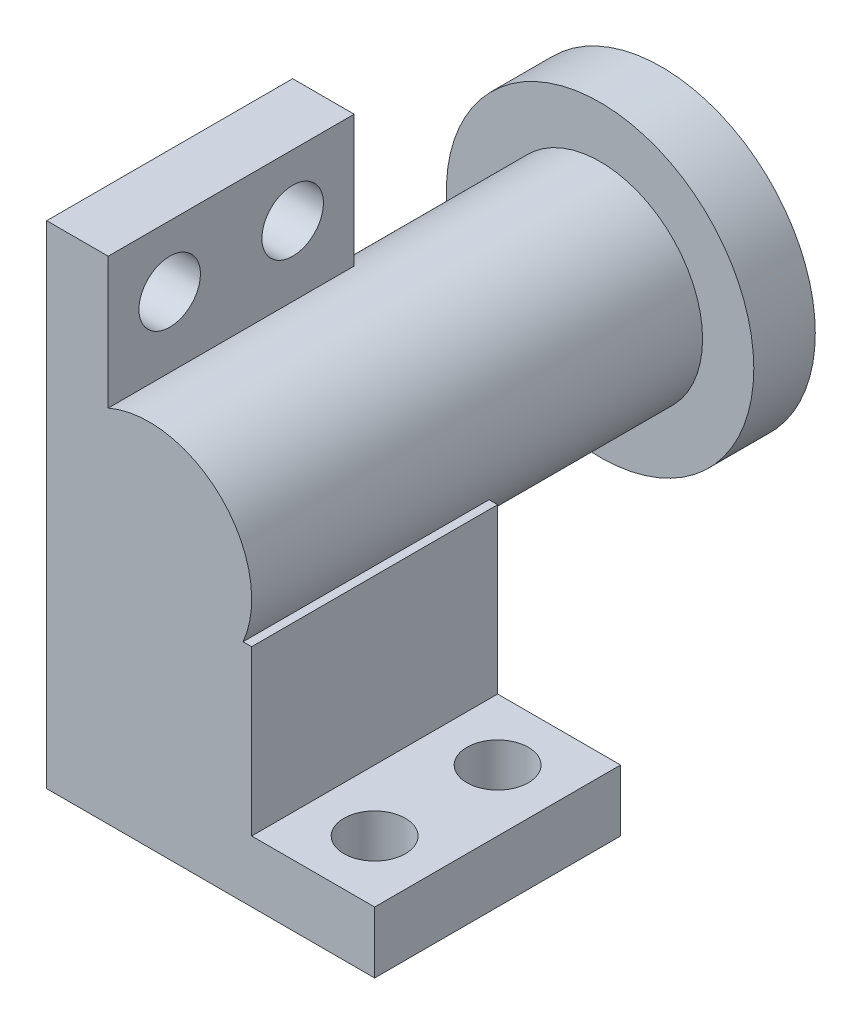
ISO-10303-21;
HEADER;
FILE_DESCRIPTION(('STEP AP214'),'2;1');
FILE_NAME('part.step','',(''),(''),'','','');
FILE_SCHEMA(('AUTOMOTIVE_DESIGN { 1 0 10303 214 1 1 1 1 }'));
ENDSEC;
DATA;
#1=APPLICATION_CONTEXT('core data for automotive mechanical design processes');
#2=APPLICATION_PROTOCOL_DEFINITION('international standard','automotive_design',2000,#1);
#3=PRODUCT_CONTEXT('',#1,'mechanical');
#4=PRODUCT('Part','Part','',(#3));
#5=PRODUCT_RELATED_PRODUCT_CATEGORY('part','',(#4));
#6=PRODUCT_DEFINITION_FORMATION('','',#4);
#7=PRODUCT_DEFINITION_CONTEXT('part definition',#1,'design');
#8=PRODUCT_DEFINITION('design','',#6,#7);
#9=PRODUCT_DEFINITION_SHAPE('','',#8);
#10=(LENGTH_UNIT() NAMED_UNIT(*) SI_UNIT(.MILLI.,.METRE.));
#11=(NAMED_UNIT(*) PLANE_ANGLE_UNIT() SI_UNIT($,.RADIAN.));
#12=(NAMED_UNIT(*) SI_UNIT($,.STERADIAN.) SOLID_ANGLE_UNIT());
#13=UNCERTAINTY_MEASURE_WITH_UNIT(LENGTH_MEASURE(1.E-05),#10,'distance_accuracy_value','');
#14=(GEOMETRIC_REPRESENTATION_CONTEXT(3) GLOBAL_UNCERTAINTY_ASSIGNED_CONTEXT((#13)) GLOBAL_UNIT_ASSIGNED_CONTEXT((#10,
#11,#12)) REPRESENTATION_CONTEXT('',''));
#15=CARTESIAN_POINT('',(0.,0.,0.));
#16=DIRECTION('',(0.,0.,1.));
#17=DIRECTION('',(1.,0.,0.));
#18=AXIS2_PLACEMENT_3D('',#15,#16,#17);
#19=CARTESIAN_POINT('',(11.,0.,38.));
#20=DIRECTION('',(-1.,0.,0.));
#21=DIRECTION('',(0.,0.,-1.));
#22=AXIS2_PLACEMENT_3D('',#19,#20,#21);
#23=PLANE('',#22);
#24=DIRECTION('',(0.,0.,1.));
#25=VECTOR('',#24,1.);
#26=CARTESIAN_POINT('',(11.,-10.,50.));
#27=LINE('',#26,#25);
#28=CARTESIAN_POINT('',(11.,-10.,38.));
#29=VERTEX_POINT('',#28);
#30=CARTESIAN_POINT('',(11.,-10.,50.));
#31=VERTEX_POINT('',#30);
#32=EDGE_CURVE('E125',#29,#31,#27,.T.);
#33=ORIENTED_EDGE('',*,*,#32,.T.);
#34=DIRECTION('',(0.,1.,0.));
#35=VECTOR('',#34,1.);
#36=CARTESIAN_POINT('',(11.,0.,50.));
#37=LINE('',#36,#35);
#38=CARTESIAN_POINT('',(11.,-13.,50.));
#39=VERTEX_POINT('',#38);
#40=EDGE_CURVE('E187',#39,#31,#37,.T.);
#41=ORIENTED_EDGE('',*,*,#40,.F.);
#42=DIRECTION('',(0.,0.,1.));
#43=VECTOR('',#42,1.);
#44=CARTESIAN_POINT('',(11.,-13.,38.));
#45=LINE('',#44,#43);
#46=CARTESIAN_POINT('',(11.,-13.,38.));
#47=VERTEX_POINT('',#46);
#48=EDGE_CURVE('E44',#47,#39,#45,.T.);
#49=ORIENTED_EDGE('',*,*,#48,.F.);
#50=DIRECTION('',(0.,1.,0.));
#51=VECTOR('',#50,1.);
#52=CARTESIAN_POINT('',(11.,0.,38.));
#53=LINE('',#52,#51);
#54=EDGE_CURVE('E172',#47,#29,#53,.T.);
#55=ORIENTED_EDGE('',*,*,#54,.T.);
#56=EDGE_LOOP('',(#33,#41,#49,#55));
#57=FACE_BOUND('',#56,.T.);
#58=ADVANCED_FACE('F35',(#57),#23,.F.);
#59=CARTESIAN_POINT('',(8.,-13.,41.));
#60=DIRECTION('',(0.,1.,0.));
#61=DIRECTION('',(0.,0.,-1.));
#62=AXIS2_PLACEMENT_3D('',#59,#60,#61);
#63=CYLINDRICAL_SURFACE('',#62,1.5);
#64=CARTESIAN_POINT('',(8.,-13.,41.));
#65=DIRECTION('',(0.,-1.,0.));
#66=DIRECTION('',(0.,0.,-1.));
#67=AXIS2_PLACEMENT_3D('',#64,#65,#66);
#68=CIRCLE('',#67,1.5);
#69=CARTESIAN_POINT('',(8.,-13.,39.5));
#70=VERTEX_POINT('',#69);
#71=EDGE_CURVE('E141',#70,#70,#68,.T.);
#72=ORIENTED_EDGE('',*,*,#71,.T.);
#73=EDGE_LOOP('',(#72));
#74=FACE_BOUND('',#73,.T.);
#75=CARTESIAN_POINT('',(8.,-10.,41.));
#76=DIRECTION('',(0.,-1.,0.));
#77=DIRECTION('',(-1.,0.,0.));
#78=AXIS2_PLACEMENT_3D('',#75,#76,#77);
#79=CIRCLE('',#78,1.5);
#80=CARTESIAN_POINT('',(6.5,-10.,41.));
#81=VERTEX_POINT('',#80);
#82=EDGE_CURVE('E138',#81,#81,#79,.F.);
#83=ORIENTED_EDGE('',*,*,#82,.T.);
#84=EDGE_LOOP('',(#83));
#85=FACE_BOUND('',#84,.T.);
#86=ADVANCED_FACE('F255',(#74,#85),#63,.F.);
#87=CARTESIAN_POINT('',(8.,-13.,47.));
#88=DIRECTION('',(0.,1.,0.));
#89=DIRECTION('',(0.,0.,-1.));
#90=AXIS2_PLACEMENT_3D('',#87,#88,#89);
#91=CYLINDRICAL_SURFACE('',#90,1.5);
#92=CARTESIAN_POINT('',(8.,-13.,47.));
#93=DIRECTION('',(0.,-1.,0.));
#94=DIRECTION('',(0.,0.,-1.));
#95=AXIS2_PLACEMENT_3D('',#92,#93,#94);
#96=CIRCLE('',#95,1.5);
#97=CARTESIAN_POINT('',(8.,-13.,45.5));
#98=VERTEX_POINT('',#97);
#99=EDGE_CURVE('E142',#98,#98,#96,.T.);
#100=ORIENTED_EDGE('',*,*,#99,.T.);
#101=EDGE_LOOP('',(#100));
#102=FACE_BOUND('',#101,.T.);
#103=CARTESIAN_POINT('',(8.,-10.,47.));
#104=DIRECTION('',(0.,-1.,0.));
#105=DIRECTION('',(-1.,0.,0.));
#106=AXIS2_PLACEMENT_3D('',#103,#104,#105);
#107=CIRCLE('',#106,1.5);
#108=CARTESIAN_POINT('',(6.5,-10.,47.));
#109=VERTEX_POINT('',#108);
#110=EDGE_CURVE('E39',#109,#109,#107,.F.);
#111=ORIENTED_EDGE('',*,*,#110,.T.);
#112=EDGE_LOOP('',(#111));
#113=FACE_BOUND('',#112,.T.);
#114=ADVANCED_FACE('F259',(#102,#113),#91,.F.);
#115=CARTESIAN_POINT('',(0.,0.,38.));
#116=DIRECTION('',(0.,0.,-1.));
#117=DIRECTION('',(1.,0.,0.));
#118=AXIS2_PLACEMENT_3D('',#115,#116,#117);
#119=PLANE('',#118);
#120=CARTESIAN_POINT('',(0.,0.,38.));
#121=DIRECTION('',(0.,0.,1.));
#122=DIRECTION('',(1.,0.,0.));
#123=AXIS2_PLACEMENT_3D('',#120,#121,#122);
#124=CIRCLE('',#123,5.);
#125=CARTESIAN_POINT('',(-2.,4.58257569495584,38.));
#126=VERTEX_POINT('',#125);
#127=CARTESIAN_POINT('',(-5.,0.,38.));
#128=VERTEX_POINT('',#127);
#129=EDGE_CURVE('E46',#126,#128,#124,.T.);
#130=ORIENTED_EDGE('',*,*,#129,.T.);
#131=DIRECTION('',(0.,1.,0.));
#132=VECTOR('',#131,1.);
#133=CARTESIAN_POINT('',(-5.,0.,38.));
#134=LINE('',#133,#132);
#135=CARTESIAN_POINT('',(-5.,11.,38.));
#136=VERTEX_POINT('',#135);
#137=EDGE_CURVE('E182',#128,#136,#134,.T.);
#138=ORIENTED_EDGE('',*,*,#137,.T.);
#139=DIRECTION('',(1.,0.,0.));
#140=VECTOR('',#139,1.);
#141=CARTESIAN_POINT('',(0.,11.,38.));
#142=LINE('',#141,#140);
#143=CARTESIAN_POINT('',(-2.,11.,38.));
#144=VERTEX_POINT('',#143);
#145=EDGE_CURVE('E179',#136,#144,#142,.T.);
#146=ORIENTED_EDGE('',*,*,#145,.T.);
#147=DIRECTION('',(0.,-1.,0.));
#148=VECTOR('',#147,1.);
#149=CARTESIAN_POINT('',(-2.,0.,38.));
#150=LINE('',#149,#148);
#151=EDGE_CURVE('E176',#144,#126,#150,.T.);
#152=ORIENTED_EDGE('',*,*,#151,.T.);
#153=EDGE_LOOP('',(#130,#138,#146,#152));
#154=FACE_BOUND('',#153,.T.);
#155=ADVANCED_FACE('F230',(#154),#119,.T.);
#156=CARTESIAN_POINT('',(0.,-13.,38.));
#157=DIRECTION('',(0.,-1.,0.));
#158=DIRECTION('',(1.,0.,0.));
#159=AXIS2_PLACEMENT_3D('',#156,#157,#158);
#160=PLANE('',#159);
#161=ORIENTED_EDGE('',*,*,#99,.F.);
#162=EDGE_LOOP('',(#161));
#163=FACE_BOUND('',#162,.T.);
#164=ORIENTED_EDGE('',*,*,#71,.F.);
#165=EDGE_LOOP('',(#164));
#166=FACE_BOUND('',#165,.T.);
#167=DIRECTION('',(-1.,0.,0.));
#168=VECTOR('',#167,1.);
#169=CARTESIAN_POINT('',(0.,-13.,50.));
#170=LINE('',#169,#168);
#171=CARTESIAN_POINT('',(-5.,-13.,50.));
#172=VERTEX_POINT('',#171);
#173=EDGE_CURVE('E167',#39,#172,#170,.T.);
#174=ORIENTED_EDGE('',*,*,#173,.T.);
#175=DIRECTION('',(0.,0.,1.));
#176=VECTOR('',#175,1.);
#177=CARTESIAN_POINT('',(-5.,-13.,38.));
#178=LINE('',#177,#176);
#179=CARTESIAN_POINT('',(-5.,-13.,38.));
#180=VERTEX_POINT('',#179);
#181=EDGE_CURVE('E184',#180,#172,#178,.T.);
#182=ORIENTED_EDGE('',*,*,#181,.F.);
#183=DIRECTION('',(-1.,0.,0.));
#184=VECTOR('',#183,1.);
#185=CARTESIAN_POINT('',(0.,-13.,38.));
#186=LINE('',#185,#184);
#187=EDGE_CURVE('E170',#47,#180,#186,.T.);
#188=ORIENTED_EDGE('',*,*,#187,.F.);
#189=ORIENTED_EDGE('',*,*,#48,.T.);
#190=EDGE_LOOP('',(#174,#182,#188,#189));
#191=FACE_BOUND('',#190,.T.);
#192=ADVANCED_FACE('F37',(#163,#166,#191),#160,.T.);
#193=CARTESIAN_POINT('',(0.,-2.,38.));
#194=DIRECTION('',(0.,-1.,0.));
#195=DIRECTION('',(1.,0.,0.));
#196=AXIS2_PLACEMENT_3D('',#193,#194,#195);
#197=PLANE('',#196);
#198=DIRECTION('',(-1.,0.,0.));
#199=VECTOR('',#198,1.);
#200=CARTESIAN_POINT('',(0.,-2.,38.));
#201=LINE('',#200,#199);
#202=CARTESIAN_POINT('',(5.,-2.,38.));
#203=VERTEX_POINT('',#202);
#204=CARTESIAN_POINT('',(4.58257569495584,-2.,38.));
#205=VERTEX_POINT('',#204);
#206=EDGE_CURVE('E132',#203,#205,#201,.T.);
#207=ORIENTED_EDGE('',*,*,#206,.T.);
#208=DIRECTION('',(0.,0.,1.));
#209=VECTOR('',#208,1.);
#210=CARTESIAN_POINT('',(4.58257569495584,-2.,38.));
#211=LINE('',#210,#209);
#212=CARTESIAN_POINT('',(4.58257569495584,-2.,50.));
#213=VERTEX_POINT('',#212);
#214=EDGE_CURVE('E211',#205,#213,#211,.T.);
#215=ORIENTED_EDGE('',*,*,#214,.T.);
#216=DIRECTION('',(-1.,0.,0.));
#217=VECTOR('',#216,1.);
#218=CARTESIAN_POINT('',(0.,-2.,50.));
#219=LINE('',#218,#217);
#220=CARTESIAN_POINT('',(5.,-2.,50.));
#221=VERTEX_POINT('',#220);
#222=EDGE_CURVE('E189',#221,#213,#219,.T.);
#223=ORIENTED_EDGE('',*,*,#222,.F.);
#224=DIRECTION('',(0.,0.,-1.));
#225=VECTOR('',#224,1.);
#226=CARTESIAN_POINT('',(5.,-2.,50.));
#227=LINE('',#226,#225);
#228=EDGE_CURVE('E120',#221,#203,#227,.T.);
#229=ORIENTED_EDGE('',*,*,#228,.T.);
#230=EDGE_LOOP('',(#207,#215,#223,#229));
#231=FACE_BOUND('',#230,.T.);
#232=ADVANCED_FACE('F238',(#231),#197,.F.);
#233=CARTESIAN_POINT('',(0.,0.,38.));
#234=DIRECTION('',(0.,0.,1.));
#235=DIRECTION('',(-1.,0.,0.));
#236=AXIS2_PLACEMENT_3D('',#233,#234,#235);
#237=CYLINDRICAL_SURFACE('',#236,5.);
#238=CARTESIAN_POINT('',(0.,0.,50.));
#239=DIRECTION('',(0.,0.,1.));
#240=DIRECTION('',(1.,0.,0.));
#241=AXIS2_PLACEMENT_3D('',#238,#239,#240);
#242=CIRCLE('',#241,5.);
#243=CARTESIAN_POINT('',(-2.,4.58257569495584,50.));
#244=VERTEX_POINT('',#243);
#245=EDGE_CURVE('E192',#213,#244,#242,.T.);
#246=ORIENTED_EDGE('',*,*,#245,.F.);
#247=ORIENTED_EDGE('',*,*,#214,.F.);
#248=EDGE_CURVE('E11',#128,#205,#124,.T.);
#249=ORIENTED_EDGE('',*,*,#248,.F.);
#250=ORIENTED_EDGE('',*,*,#129,.F.);
#251=DIRECTION('',(0.,0.,1.));
#252=VECTOR('',#251,1.);
#253=CARTESIAN_POINT('',(-2.,4.58257569495584,38.));
#254=LINE('',#253,#252);
#255=EDGE_CURVE('E208',#126,#244,#254,.T.);
#256=ORIENTED_EDGE('',*,*,#255,.T.);
#257=EDGE_LOOP('',(#246,#247,#249,#250,#256));
#258=FACE_BOUND('',#257,.T.);
#259=CARTESIAN_POINT('',(0.,0.,28.));
#260=DIRECTION('',(0.,0.,1.));
#261=DIRECTION('',(1.,0.,0.));
#262=AXIS2_PLACEMENT_3D('',#259,#260,#261);
#263=CIRCLE('',#262,5.);
#264=CARTESIAN_POINT('',(5.,0.,28.));
#265=VERTEX_POINT('',#264);
#266=EDGE_CURVE('E165',#265,#265,#263,.T.);
#267=ORIENTED_EDGE('',*,*,#266,.T.);
#268=EDGE_LOOP('',(#267));
#269=FACE_BOUND('',#268,.T.);
#270=ADVANCED_FACE('F233',(#258,#269),#237,.T.);
#271=CARTESIAN_POINT('',(-2.,0.,38.));
#272=DIRECTION('',(1.,0.,0.));
#273=DIRECTION('',(0.,1.,0.));
#274=AXIS2_PLACEMENT_3D('',#271,#272,#273);
#275=PLANE('',#274);
#276=CARTESIAN_POINT('',(-2.,7.99853829447893,41.));
#277=DIRECTION('',(-1.,0.,0.));
#278=DIRECTION('',(0.,1.,0.));
#279=AXIS2_PLACEMENT_3D('',#276,#277,#278);
#280=CIRCLE('',#279,1.5);
#281=CARTESIAN_POINT('',(-2.,9.49853829447893,41.));
#282=VERTEX_POINT('',#281);
#283=EDGE_CURVE('E152',#282,#282,#280,.T.);
#284=ORIENTED_EDGE('',*,*,#283,.T.);
#285=EDGE_LOOP('',(#284));
#286=FACE_BOUND('',#285,.T.);
#287=CARTESIAN_POINT('',(-2.,7.99853829447893,47.));
#288=DIRECTION('',(-1.,0.,0.));
#289=DIRECTION('',(0.,1.,0.));
#290=AXIS2_PLACEMENT_3D('',#287,#288,#289);
#291=CIRCLE('',#290,1.5);
#292=CARTESIAN_POINT('',(-2.,9.49853829447893,47.));
#293=VERTEX_POINT('',#292);
#294=EDGE_CURVE('E145',#293,#293,#291,.T.);
#295=ORIENTED_EDGE('',*,*,#294,.T.);
#296=EDGE_LOOP('',(#295));
#297=FACE_BOUND('',#296,.T.);
#298=DIRECTION('',(0.,-1.,0.));
#299=VECTOR('',#298,1.);
#300=CARTESIAN_POINT('',(-2.,0.,50.));
#301=LINE('',#300,#299);
#302=CARTESIAN_POINT('',(-2.,11.,50.));
#303=VERTEX_POINT('',#302);
#304=EDGE_CURVE('E195',#303,#244,#301,.T.);
#305=ORIENTED_EDGE('',*,*,#304,.T.);
#306=ORIENTED_EDGE('',*,*,#255,.F.);
#307=ORIENTED_EDGE('',*,*,#151,.F.);
#308=DIRECTION('',(0.,0.,1.));
#309=VECTOR('',#308,1.);
#310=CARTESIAN_POINT('',(-2.,11.,38.));
#311=LINE('',#310,#309);
#312=EDGE_CURVE('E205',#144,#303,#311,.T.);
#313=ORIENTED_EDGE('',*,*,#312,.T.);
#314=EDGE_LOOP('',(#305,#306,#307,#313));
#315=FACE_BOUND('',#314,.T.);
#316=ADVANCED_FACE('F241',(#286,#297,#315),#275,.T.);
#317=CARTESIAN_POINT('',(0.,11.,38.));
#318=DIRECTION('',(0.,1.,0.));
#319=DIRECTION('',(0.,0.,-1.));
#320=AXIS2_PLACEMENT_3D('',#317,#318,#319);
#321=PLANE('',#320);
#322=DIRECTION('',(1.,0.,0.));
#323=VECTOR('',#322,1.);
#324=CARTESIAN_POINT('',(0.,11.,50.));
#325=LINE('',#324,#323);
#326=CARTESIAN_POINT('',(-5.,11.,50.));
#327=VERTEX_POINT('',#326);
#328=EDGE_CURVE('E197',#327,#303,#325,.T.);
#329=ORIENTED_EDGE('',*,*,#328,.T.);
#330=ORIENTED_EDGE('',*,*,#312,.F.);
#331=ORIENTED_EDGE('',*,*,#145,.F.);
#332=DIRECTION('',(0.,0.,1.));
#333=VECTOR('',#332,1.);
#334=CARTESIAN_POINT('',(-5.,11.,38.));
#335=LINE('',#334,#333);
#336=EDGE_CURVE('E202',#136,#327,#335,.T.);
#337=ORIENTED_EDGE('',*,*,#336,.T.);
#338=EDGE_LOOP('',(#329,#330,#331,#337));
#339=FACE_BOUND('',#338,.T.);
#340=ADVANCED_FACE('F243',(#339),#321,.T.);
#341=CARTESIAN_POINT('',(-5.,0.,38.));
#342=DIRECTION('',(-1.,0.,0.));
#343=DIRECTION('',(0.,0.,-1.));
#344=AXIS2_PLACEMENT_3D('',#341,#342,#343);
#345=PLANE('',#344);
#346=CARTESIAN_POINT('',(-5.,7.99853829447893,41.));
#347=DIRECTION('',(-1.,0.,0.));
#348=DIRECTION('',(0.,1.,0.));
#349=AXIS2_PLACEMENT_3D('',#346,#347,#348);
#350=CIRCLE('',#349,1.5);
#351=CARTESIAN_POINT('',(-5.,9.49853829447893,41.));
#352=VERTEX_POINT('',#351);
#353=EDGE_CURVE('E148',#352,#352,#350,.T.);
#354=ORIENTED_EDGE('',*,*,#353,.F.);
#355=EDGE_LOOP('',(#354));
#356=FACE_BOUND('',#355,.T.);
#357=CARTESIAN_POINT('',(-5.,7.99853829447893,47.));
#358=DIRECTION('',(-1.,0.,0.));
#359=DIRECTION('',(0.,1.,0.));
#360=AXIS2_PLACEMENT_3D('',#357,#358,#359);
#361=CIRCLE('',#360,1.5);
#362=CARTESIAN_POINT('',(-5.,9.49853829447893,47.));
#363=VERTEX_POINT('',#362);
#364=EDGE_CURVE('E155',#363,#363,#361,.T.);
#365=ORIENTED_EDGE('',*,*,#364,.F.);
#366=EDGE_LOOP('',(#365));
#367=FACE_BOUND('',#366,.T.);
#368=DIRECTION('',(0.,1.,0.));
#369=VECTOR('',#368,1.);
#370=CARTESIAN_POINT('',(-5.,0.,50.));
#371=LINE('',#370,#369);
#372=EDGE_CURVE('E173',#172,#327,#371,.T.);
#373=ORIENTED_EDGE('',*,*,#372,.T.);
#374=ORIENTED_EDGE('',*,*,#336,.F.);
#375=ORIENTED_EDGE('',*,*,#137,.F.);
#376=EDGE_CURVE('E60',#180,#128,#134,.T.);
#377=ORIENTED_EDGE('',*,*,#376,.F.);
#378=ORIENTED_EDGE('',*,*,#181,.T.);
#379=EDGE_LOOP('',(#373,#374,#375,#377,#378));
#380=FACE_BOUND('',#379,.T.);
#381=ADVANCED_FACE('F224',(#356,#367,#380),#345,.T.);
#382=DIRECTION('',(0.,1.,0.));
#383=VECTOR('',#382,1.);
#384=CARTESIAN_POINT('',(5.,-10.,38.));
#385=LINE('',#384,#383);
#386=CARTESIAN_POINT('',(5.,-10.,38.));
#387=VERTEX_POINT('',#386);
#388=EDGE_CURVE('E116',#387,#203,#385,.T.);
#389=ORIENTED_EDGE('',*,*,#388,.F.);
#390=DIRECTION('',(1.,0.,0.));
#391=VECTOR('',#390,1.);
#392=CARTESIAN_POINT('',(5.,-10.,38.));
#393=LINE('',#392,#391);
#394=EDGE_CURVE('E119',#387,#29,#393,.T.);
#395=ORIENTED_EDGE('',*,*,#394,.T.);
#396=ORIENTED_EDGE('',*,*,#54,.F.);
#397=ORIENTED_EDGE('',*,*,#187,.T.);
#398=ORIENTED_EDGE('',*,*,#376,.T.);
#399=ORIENTED_EDGE('',*,*,#248,.T.);
#400=ORIENTED_EDGE('',*,*,#206,.F.);
#401=EDGE_LOOP('',(#389,#395,#396,#397,#398,#399,#400));
#402=FACE_BOUND('',#401,.T.);
#403=ADVANCED_FACE('F130',(#402),#119,.T.);
#404=CARTESIAN_POINT('',(0.,0.,50.));
#405=DIRECTION('',(0.,0.,-1.));
#406=DIRECTION('',(1.,0.,0.));
#407=AXIS2_PLACEMENT_3D('',#404,#405,#406);
#408=PLANE('',#407);
#409=ORIENTED_EDGE('',*,*,#222,.T.);
#410=ORIENTED_EDGE('',*,*,#245,.T.);
#411=ORIENTED_EDGE('',*,*,#304,.F.);
#412=ORIENTED_EDGE('',*,*,#328,.F.);
#413=ORIENTED_EDGE('',*,*,#372,.F.);
#414=ORIENTED_EDGE('',*,*,#173,.F.);
#415=ORIENTED_EDGE('',*,*,#40,.T.);
#416=DIRECTION('',(-1.,0.,0.));
#417=VECTOR('',#416,1.);
#418=CARTESIAN_POINT('',(5.,-10.,50.));
#419=LINE('',#418,#417);
#420=CARTESIAN_POINT('',(5.,-10.,50.));
#421=VERTEX_POINT('',#420);
#422=EDGE_CURVE('E53',#31,#421,#419,.T.);
#423=ORIENTED_EDGE('',*,*,#422,.T.);
#424=DIRECTION('',(0.,1.,0.));
#425=VECTOR('',#424,1.);
#426=CARTESIAN_POINT('',(5.,-10.,50.));
#427=LINE('',#426,#425);
#428=EDGE_CURVE('E118',#421,#221,#427,.T.);
#429=ORIENTED_EDGE('',*,*,#428,.T.);
#430=EDGE_LOOP('',(#409,#410,#411,#412,#413,#414,#415,#423,#429));
#431=FACE_BOUND('',#430,.T.);
#432=ADVANCED_FACE('F220',(#431),#408,.F.);
#433=CARTESIAN_POINT('',(0.,0.,25.));
#434=DIRECTION('',(0.,0.,1.));
#435=DIRECTION('',(-1.,0.,0.));
#436=AXIS2_PLACEMENT_3D('',#433,#434,#435);
#437=CYLINDRICAL_SURFACE('',#436,7.5);
#438=CARTESIAN_POINT('',(0.,0.,25.));
#439=DIRECTION('',(0.,0.,1.));
#440=DIRECTION('',(1.,0.,0.));
#441=AXIS2_PLACEMENT_3D('',#438,#439,#440);
#442=CIRCLE('',#441,7.5);
#443=CARTESIAN_POINT('',(7.5,0.,25.));
#444=VERTEX_POINT('',#443);
#445=EDGE_CURVE('E160',#444,#444,#442,.T.);
#446=ORIENTED_EDGE('',*,*,#445,.T.);
#447=EDGE_LOOP('',(#446));
#448=FACE_BOUND('',#447,.T.);
#449=CARTESIAN_POINT('',(0.,0.,28.));
#450=DIRECTION('',(0.,0.,1.));
#451=DIRECTION('',(1.,0.,0.));
#452=AXIS2_PLACEMENT_3D('',#449,#450,#451);
#453=CIRCLE('',#452,7.5);
#454=CARTESIAN_POINT('',(7.5,0.,28.));
#455=VERTEX_POINT('',#454);
#456=EDGE_CURVE('E151',#455,#455,#453,.T.);
#457=ORIENTED_EDGE('',*,*,#456,.F.);
#458=EDGE_LOOP('',(#457));
#459=FACE_BOUND('',#458,.T.);
#460=ADVANCED_FACE('F307',(#448,#459),#437,.T.);
#461=CARTESIAN_POINT('',(0.,0.,25.));
#462=DIRECTION('',(0.,0.,-1.));
#463=DIRECTION('',(1.,0.,0.));
#464=AXIS2_PLACEMENT_3D('',#461,#462,#463);
#465=PLANE('',#464);
#466=ORIENTED_EDGE('',*,*,#445,.F.);
#467=EDGE_LOOP('',(#466));
#468=FACE_BOUND('',#467,.T.);
#469=ADVANCED_FACE('F317',(#468),#465,.T.);
#470=CARTESIAN_POINT('',(0.,0.,28.));
#471=DIRECTION('',(0.,0.,-1.));
#472=DIRECTION('',(1.,0.,0.));
#473=AXIS2_PLACEMENT_3D('',#470,#471,#472);
#474=PLANE('',#473);
#475=ORIENTED_EDGE('',*,*,#266,.F.);
#476=EDGE_LOOP('',(#475));
#477=FACE_BOUND('',#476,.T.);
#478=ORIENTED_EDGE('',*,*,#456,.T.);
#479=EDGE_LOOP('',(#478));
#480=FACE_BOUND('',#479,.T.);
#481=ADVANCED_FACE('F327',(#477,#480),#474,.F.);
#482=CARTESIAN_POINT('',(-5.,7.99853829447893,47.));
#483=DIRECTION('',(1.,0.,0.));
#484=DIRECTION('',(0.,1.,0.));
#485=AXIS2_PLACEMENT_3D('',#482,#483,#484);
#486=CYLINDRICAL_SURFACE('',#485,1.5);
#487=ORIENTED_EDGE('',*,*,#364,.T.);
#488=EDGE_LOOP('',(#487));
#489=FACE_BOUND('',#488,.T.);
#490=ORIENTED_EDGE('',*,*,#294,.F.);
#491=EDGE_LOOP('',(#490));
#492=FACE_BOUND('',#491,.T.);
#493=ADVANCED_FACE('F337',(#489,#492),#486,.F.);
#494=CARTESIAN_POINT('',(-5.,7.99853829447893,41.));
#495=DIRECTION('',(1.,0.,0.));
#496=DIRECTION('',(0.,1.,0.));
#497=AXIS2_PLACEMENT_3D('',#494,#495,#496);
#498=CYLINDRICAL_SURFACE('',#497,1.5);
#499=ORIENTED_EDGE('',*,*,#353,.T.);
#500=EDGE_LOOP('',(#499));
#501=FACE_BOUND('',#500,.T.);
#502=ORIENTED_EDGE('',*,*,#283,.F.);
#503=EDGE_LOOP('',(#502));
#504=FACE_BOUND('',#503,.T.);
#505=ADVANCED_FACE('F347',(#501,#504),#498,.F.);
#506=CARTESIAN_POINT('',(0.,-10.,50.));
#507=DIRECTION('',(0.,1.,0.));
#508=DIRECTION('',(-1.,0.,0.));
#509=AXIS2_PLACEMENT_3D('',#506,#507,#508);
#510=PLANE('',#509);
#511=DIRECTION('',(0.,0.,-1.));
#512=VECTOR('',#511,1.);
#513=CARTESIAN_POINT('',(5.,-10.,50.));
#514=LINE('',#513,#512);
#515=EDGE_CURVE('E111',#421,#387,#514,.T.);
#516=ORIENTED_EDGE('',*,*,#515,.F.);
#517=ORIENTED_EDGE('',*,*,#422,.F.);
#518=ORIENTED_EDGE('',*,*,#32,.F.);
#519=ORIENTED_EDGE('',*,*,#394,.F.);
#520=EDGE_LOOP('',(#516,#517,#518,#519));
#521=FACE_BOUND('',#520,.T.);
#522=ORIENTED_EDGE('',*,*,#110,.F.);
#523=EDGE_LOOP('',(#522));
#524=FACE_BOUND('',#523,.T.);
#525=ORIENTED_EDGE('',*,*,#82,.F.);
#526=EDGE_LOOP('',(#525));
#527=FACE_BOUND('',#526,.T.);
#528=ADVANCED_FACE('F122',(#521,#524,#527),#510,.T.);
#529=CARTESIAN_POINT('',(5.,-10.,50.));
#530=DIRECTION('',(-1.,0.,0.));
#531=DIRECTION('',(0.,-1.,0.));
#532=AXIS2_PLACEMENT_3D('',#529,#530,#531);
#533=PLANE('',#532);
#534=ORIENTED_EDGE('',*,*,#228,.F.);
#535=ORIENTED_EDGE('',*,*,#428,.F.);
#536=ORIENTED_EDGE('',*,*,#515,.T.);
#537=ORIENTED_EDGE('',*,*,#388,.T.);
#538=EDGE_LOOP('',(#534,#535,#536,#537));
#539=FACE_BOUND('',#538,.T.);
#540=ADVANCED_FACE('F114',(#539),#533,.F.);
#541=CLOSED_SHELL('',(#58,#86,#114,#155,#192,#232,#270,#316,#340,#381,#403,#432,#460,#469,#481,
#493,#505,#528,#540));
#542=MANIFOLD_SOLID_BREP('B2',#541);
#543=ADVANCED_BREP_SHAPE_REPRESENTATION('',(#18,#542),#14);
#544=SHAPE_DEFINITION_REPRESENTATION(#9,#543);
ENDSEC;
END-ISO-10303-21;
